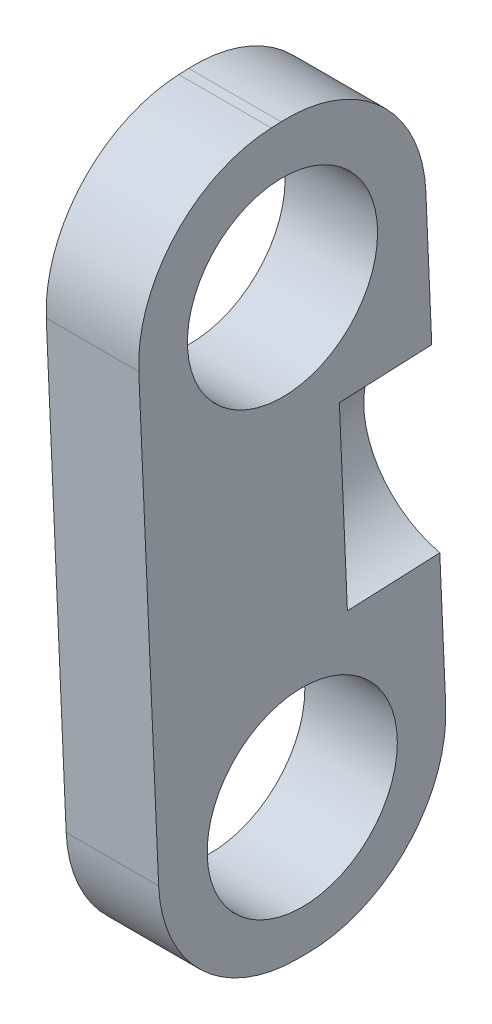
ISO-10303-21;
HEADER;
FILE_DESCRIPTION(('STEP AP214'),'2;1');
FILE_NAME('part.step','',(''),(''),'','','');
FILE_SCHEMA(('AUTOMOTIVE_DESIGN { 1 0 10303 214 1 1 1 1 }'));
ENDSEC;
DATA;
#1=APPLICATION_CONTEXT('core data for automotive mechanical design processes');
#2=APPLICATION_PROTOCOL_DEFINITION('international standard','automotive_design',2000,#1);
#3=PRODUCT_CONTEXT('',#1,'mechanical');
#4=PRODUCT('Part','Part','',(#3));
#5=PRODUCT_RELATED_PRODUCT_CATEGORY('part','',(#4));
#6=PRODUCT_DEFINITION_FORMATION('','',#4);
#7=PRODUCT_DEFINITION_CONTEXT('part definition',#1,'design');
#8=PRODUCT_DEFINITION('design','',#6,#7);
#9=PRODUCT_DEFINITION_SHAPE('','',#8);
#10=(LENGTH_UNIT() NAMED_UNIT(*) SI_UNIT(.MILLI.,.METRE.));
#11=(NAMED_UNIT(*) PLANE_ANGLE_UNIT() SI_UNIT($,.RADIAN.));
#12=(NAMED_UNIT(*) SI_UNIT($,.STERADIAN.) SOLID_ANGLE_UNIT());
#13=UNCERTAINTY_MEASURE_WITH_UNIT(LENGTH_MEASURE(1.E-05),#10,'distance_accuracy_value','');
#14=(GEOMETRIC_REPRESENTATION_CONTEXT(3) GLOBAL_UNCERTAINTY_ASSIGNED_CONTEXT((#13)) GLOBAL_UNIT_ASSIGNED_CONTEXT((#10,
#11,#12)) REPRESENTATION_CONTEXT('',''));
#15=CARTESIAN_POINT('',(0.,0.,0.));
#16=DIRECTION('',(0.,0.,1.));
#17=DIRECTION('',(1.,0.,0.));
#18=AXIS2_PLACEMENT_3D('',#15,#16,#17);
#19=CARTESIAN_POINT('',(3.175,0.,0.));
#20=DIRECTION('',(-1.,0.,0.));
#21=DIRECTION('',(0.,0.,1.));
#22=AXIS2_PLACEMENT_3D('',#19,#20,#21);
#23=PLANE('',#22);
#24=DIRECTION('',(0.,-0.999048221581858,-0.0436193873653358));
#25=VECTOR('',#24,1.);
#26=CARTESIAN_POINT('',(3.175,7.82477285099917,-179.216762849016));
#27=LINE('',#26,#25);
#28=CARTESIAN_POINT('',(3.175,11.0938075378479,-179.074033712187));
#29=VERTEX_POINT('',#28);
#30=CARTESIAN_POINT('',(3.175,4.7680083411944,-179.350224069763));
#31=VERTEX_POINT('',#30);
#32=EDGE_CURVE('E11',#29,#31,#27,.T.);
#33=ORIENTED_EDGE('',*,*,#32,.F.);
#34=DIRECTION('',(0.,0.0436193873653358,-0.999048221581858));
#35=VECTOR('',#34,1.);
#36=CARTESIAN_POINT('',(3.175,11.0938075378479,-179.074033712187));
#37=LINE('',#36,#35);
#38=CARTESIAN_POINT('',(3.175,11.2322990927329,-182.24601181571));
#39=VERTEX_POINT('',#38);
#40=EDGE_CURVE('E124',#29,#39,#37,.T.);
#41=ORIENTED_EDGE('',*,*,#40,.T.);
#42=DIRECTION('',(0.,0.999048221581858,0.0436193873653358));
#43=VECTOR('',#42,1.);
#44=CARTESIAN_POINT('',(3.175,7.96326440588419,-182.388740952538));
#45=LINE('',#44,#43);
#46=CARTESIAN_POINT('',(3.175,15.8932096646902,-182.042512065326));
#47=VERTEX_POINT('',#46);
#48=EDGE_CURVE('E158',#39,#47,#45,.T.);
#49=ORIENTED_EDGE('',*,*,#48,.T.);
#50=CARTESIAN_POINT('',(3.175,15.6854723323628,-177.284544910042));
#51=DIRECTION('',(-1.,0.,0.));
#52=DIRECTION('',(0.,0.,1.));
#53=AXIS2_PLACEMENT_3D('',#50,#51,#52);
#54=CIRCLE('',#53,4.7625);
#55=CARTESIAN_POINT('',(3.175,20.4434394876464,-177.076807577715));
#56=VERTEX_POINT('',#55);
#57=EDGE_CURVE('E219',#47,#56,#54,.F.);
#58=ORIENTED_EDGE('',*,*,#57,.T.);
#59=DIRECTION('',(0.,-0.0436193873653367,0.999048221581858));
#60=VECTOR('',#59,1.);
#61=CARTESIAN_POINT('',(3.175,20.6511768199738,-181.834774732998));
#62=LINE('',#61,#60);
#63=CARTESIAN_POINT('',(3.175,20.4286764010665,-176.738677303918));
#64=VERTEX_POINT('',#63);
#65=EDGE_CURVE('E157',#56,#64,#62,.T.);
#66=ORIENTED_EDGE('',*,*,#65,.T.);
#67=CARTESIAN_POINT('',(3.175,15.6707092457829,-176.946414636246));
#68=DIRECTION('',(-1.,0.,0.));
#69=DIRECTION('',(0.,0.,1.));
#70=AXIS2_PLACEMENT_3D('',#67,#68,#69);
#71=CIRCLE('',#70,4.7625);
#72=CARTESIAN_POINT('',(3.175,15.4629719134555,-172.188447480962));
#73=VERTEX_POINT('',#72);
#74=EDGE_CURVE('E210',#64,#73,#71,.F.);
#75=ORIENTED_EDGE('',*,*,#74,.T.);
#76=DIRECTION('',(0.,-0.999048221581858,-0.0436193873653391));
#77=VECTOR('',#76,1.);
#78=CARTESIAN_POINT('',(3.175,-4.72464800820541,-173.06985800182));
#79=LINE('',#78,#77);
#80=CARTESIAN_POINT('',(3.175,-0.169885340532834,-172.870992769025));
#81=VERTEX_POINT('',#80);
#82=EDGE_CURVE('E162',#73,#81,#79,.T.);
#83=ORIENTED_EDGE('',*,*,#82,.T.);
#84=CARTESIAN_POINT('',(3.175,0.0378519917945936,-177.628959924309));
#85=DIRECTION('',(-1.,0.,0.));
#86=DIRECTION('',(0.,0.,1.));
#87=AXIS2_PLACEMENT_3D('',#84,#85,#86);
#88=CIRCLE('',#87,4.7625);
#89=CARTESIAN_POINT('',(3.175,-4.72464800820541,-177.628959924309));
#90=VERTEX_POINT('',#89);
#91=EDGE_CURVE('E213',#81,#90,#88,.F.);
#92=ORIENTED_EDGE('',*,*,#91,.T.);
#93=DIRECTION('',(0.,0.,-1.));
#94=VECTOR('',#93,1.);
#95=CARTESIAN_POINT('',(3.175,-4.7246480082054,-182.942707172078));
#96=LINE('',#95,#94);
#97=CARTESIAN_POINT('',(3.175,-4.72464800820541,-177.967734768386));
#98=VERTEX_POINT('',#97);
#99=EDGE_CURVE('E166',#90,#98,#96,.T.);
#100=ORIENTED_EDGE('',*,*,#99,.T.);
#101=CARTESIAN_POINT('',(3.175,0.0378519917945937,-177.967734768386));
#102=DIRECTION('',(-1.,0.,0.));
#103=DIRECTION('',(0.,0.,1.));
#104=AXIS2_PLACEMENT_3D('',#101,#102,#103);
#105=CIRCLE('',#104,4.7625);
#106=CARTESIAN_POINT('',(3.175,0.245589324122006,-182.725701923669));
#107=VERTEX_POINT('',#106);
#108=EDGE_CURVE('E216',#98,#107,#105,.F.);
#109=ORIENTED_EDGE('',*,*,#108,.T.);
#110=CARTESIAN_POINT('',(3.175,4.90649989607934,-182.522202173285));
#111=VERTEX_POINT('',#110);
#112=EDGE_CURVE('E131',#107,#111,#45,.T.);
#113=ORIENTED_EDGE('',*,*,#112,.T.);
#114=DIRECTION('',(0.,0.0436193873653358,-0.999048221581858));
#115=VECTOR('',#114,1.);
#116=CARTESIAN_POINT('',(3.175,4.7680083411944,-179.350224069763));
#117=LINE('',#116,#115);
#118=EDGE_CURVE('E55',#111,#31,#117,.F.);
#119=ORIENTED_EDGE('',*,*,#118,.T.);
#120=EDGE_LOOP('',(#33,#41,#49,#58,#66,#75,#83,#92,#100,#109,#113,#119));
#121=FACE_BOUND('',#120,.T.);
#122=CARTESIAN_POINT('',(3.175,15.4962910605337,-177.123417320712));
#123=DIRECTION('',(1.,0.,0.));
#124=DIRECTION('',(0.,0.,-1.));
#125=AXIS2_PLACEMENT_3D('',#122,#123,#124);
#126=CIRCLE('',#125,3.26389999999998);
#127=CARTESIAN_POINT('',(3.175,15.4962910605337,-180.387317320712));
#128=VERTEX_POINT('',#127);
#129=EDGE_CURVE('E147',#128,#128,#126,.T.);
#130=ORIENTED_EDGE('',*,*,#129,.F.);
#131=EDGE_LOOP('',(#130));
#132=FACE_BOUND('',#131,.T.);
#133=CARTESIAN_POINT('',(3.175,0.,-177.8));
#134=DIRECTION('',(1.,0.,0.));
#135=DIRECTION('',(0.,0.,-1.));
#136=AXIS2_PLACEMENT_3D('',#133,#134,#135);
#137=CIRCLE('',#136,3.26390000000001);
#138=CARTESIAN_POINT('',(3.175,0.,-181.0639));
#139=VERTEX_POINT('',#138);
#140=EDGE_CURVE('E139',#139,#139,#137,.T.);
#141=ORIENTED_EDGE('',*,*,#140,.F.);
#142=EDGE_LOOP('',(#141));
#143=FACE_BOUND('',#142,.T.);
#144=ADVANCED_FACE('F39',(#121,#132,#143),#23,.F.);
#145=CARTESIAN_POINT('',(0.,0.,0.));
#146=DIRECTION('',(-1.,0.,0.));
#147=DIRECTION('',(0.,0.,1.));
#148=AXIS2_PLACEMENT_3D('',#145,#146,#147);
#149=PLANE('',#148);
#150=CARTESIAN_POINT('',(0.,15.4962910605337,-177.123417320712));
#151=DIRECTION('',(1.,0.,0.));
#152=DIRECTION('',(0.,0.,-1.));
#153=AXIS2_PLACEMENT_3D('',#150,#151,#152);
#154=CIRCLE('',#153,3.26389999999998);
#155=CARTESIAN_POINT('',(0.,15.4962910605337,-180.387317320712));
#156=VERTEX_POINT('',#155);
#157=EDGE_CURVE('E143',#156,#156,#154,.T.);
#158=ORIENTED_EDGE('',*,*,#157,.T.);
#159=EDGE_LOOP('',(#158));
#160=FACE_BOUND('',#159,.T.);
#161=DIRECTION('',(0.,-0.0436193873653367,0.999048221581858));
#162=VECTOR('',#161,1.);
#163=CARTESIAN_POINT('',(0.,20.6511768199738,-181.834774732998));
#164=LINE('',#163,#162);
#165=CARTESIAN_POINT('',(0.,20.4434394876464,-177.076807577715));
#166=VERTEX_POINT('',#165);
#167=CARTESIAN_POINT('',(0.,20.4286764010665,-176.738677303918));
#168=VERTEX_POINT('',#167);
#169=EDGE_CURVE('E173',#166,#168,#164,.T.);
#170=ORIENTED_EDGE('',*,*,#169,.F.);
#171=CARTESIAN_POINT('',(0.,15.6854723323628,-177.284544910042));
#172=DIRECTION('',(-1.,0.,0.));
#173=DIRECTION('',(0.,0.,1.));
#174=AXIS2_PLACEMENT_3D('',#171,#172,#173);
#175=CIRCLE('',#174,4.7625);
#176=CARTESIAN_POINT('',(0.,15.8932096646902,-182.042512065326));
#177=VERTEX_POINT('',#176);
#178=EDGE_CURVE('E199',#166,#177,#175,.T.);
#179=ORIENTED_EDGE('',*,*,#178,.T.);
#180=DIRECTION('',(0.,0.999048221581858,0.0436193873653358));
#181=VECTOR('',#180,1.);
#182=CARTESIAN_POINT('',(0.,7.96326440588419,-182.388740952538));
#183=LINE('',#182,#181);
#184=CARTESIAN_POINT('',(0.,0.245589324122008,-182.725701923669));
#185=VERTEX_POINT('',#184);
#186=EDGE_CURVE('E151',#185,#177,#183,.T.);
#187=ORIENTED_EDGE('',*,*,#186,.F.);
#188=CARTESIAN_POINT('',(0.,0.0378519917945937,-177.967734768386));
#189=DIRECTION('',(-1.,0.,0.));
#190=DIRECTION('',(0.,0.,1.));
#191=AXIS2_PLACEMENT_3D('',#188,#189,#190);
#192=CIRCLE('',#191,4.7625);
#193=CARTESIAN_POINT('',(0.,-4.72464800820541,-177.967734768386));
#194=VERTEX_POINT('',#193);
#195=EDGE_CURVE('E196',#185,#194,#192,.T.);
#196=ORIENTED_EDGE('',*,*,#195,.T.);
#197=DIRECTION('',(0.,0.,-1.));
#198=VECTOR('',#197,1.);
#199=CARTESIAN_POINT('',(0.,-4.7246480082054,-182.942707172078));
#200=LINE('',#199,#198);
#201=CARTESIAN_POINT('',(0.,-4.72464800820541,-177.628959924309));
#202=VERTEX_POINT('',#201);
#203=EDGE_CURVE('E181',#202,#194,#200,.T.);
#204=ORIENTED_EDGE('',*,*,#203,.F.);
#205=CARTESIAN_POINT('',(0.,0.0378519917945936,-177.628959924309));
#206=DIRECTION('',(-1.,0.,0.));
#207=DIRECTION('',(0.,0.,1.));
#208=AXIS2_PLACEMENT_3D('',#205,#206,#207);
#209=CIRCLE('',#208,4.7625);
#210=CARTESIAN_POINT('',(0.,-0.169885340532834,-172.870992769025));
#211=VERTEX_POINT('',#210);
#212=EDGE_CURVE('E193',#202,#211,#209,.T.);
#213=ORIENTED_EDGE('',*,*,#212,.T.);
#214=DIRECTION('',(0.,-0.999048221581858,-0.0436193873653391));
#215=VECTOR('',#214,1.);
#216=CARTESIAN_POINT('',(0.,-4.72464800820541,-173.06985800182));
#217=LINE('',#216,#215);
#218=CARTESIAN_POINT('',(0.,15.4629719134555,-172.188447480962));
#219=VERTEX_POINT('',#218);
#220=EDGE_CURVE('E177',#219,#211,#217,.T.);
#221=ORIENTED_EDGE('',*,*,#220,.F.);
#222=CARTESIAN_POINT('',(0.,15.6707092457829,-176.946414636246));
#223=DIRECTION('',(-1.,0.,0.));
#224=DIRECTION('',(0.,0.,1.));
#225=AXIS2_PLACEMENT_3D('',#222,#223,#224);
#226=CIRCLE('',#225,4.7625);
#227=EDGE_CURVE('E190',#219,#168,#226,.T.);
#228=ORIENTED_EDGE('',*,*,#227,.T.);
#229=EDGE_LOOP('',(#170,#179,#187,#196,#204,#213,#221,#228));
#230=FACE_BOUND('',#229,.T.);
#231=CARTESIAN_POINT('',(0.,0.,-177.8));
#232=DIRECTION('',(1.,0.,0.));
#233=DIRECTION('',(0.,0.,-1.));
#234=AXIS2_PLACEMENT_3D('',#231,#232,#233);
#235=CIRCLE('',#234,3.26390000000001);
#236=CARTESIAN_POINT('',(0.,0.,-181.0639));
#237=VERTEX_POINT('',#236);
#238=EDGE_CURVE('E135',#237,#237,#235,.T.);
#239=ORIENTED_EDGE('',*,*,#238,.T.);
#240=EDGE_LOOP('',(#239));
#241=FACE_BOUND('',#240,.T.);
#242=ADVANCED_FACE('F247',(#160,#230,#241),#149,.T.);
#243=CARTESIAN_POINT('',(3.175,7.96326440588419,-182.388740952538));
#244=DIRECTION('',(0.,-0.0436193873653358,0.999048221581858));
#245=DIRECTION('',(0.,-0.999048221581858,-0.0436193873653358));
#246=AXIS2_PLACEMENT_3D('',#243,#244,#245);
#247=PLANE('',#246);
#248=ORIENTED_EDGE('',*,*,#48,.F.);
#249=CARTESIAN_POINT('',(3.96875,8.0693994944061,-182.384106994497));
#250=DIRECTION('',(0.,0.0436193873653358,-0.999048221581858));
#251=DIRECTION('',(0.,0.999048221581858,0.0436193873653358));
#252=AXIS2_PLACEMENT_3D('',#249,#250,#251);
#253=CIRCLE('',#252,3.2639);
#254=EDGE_CURVE('E126',#111,#39,#253,.T.);
#255=ORIENTED_EDGE('',*,*,#254,.F.);
#256=ORIENTED_EDGE('',*,*,#112,.F.);
#257=DIRECTION('',(-1.,0.,0.));
#258=VECTOR('',#257,1.);
#259=CARTESIAN_POINT('',(3.175,0.245589324122005,-182.725701923669));
#260=LINE('',#259,#258);
#261=EDGE_CURVE('E202',#107,#185,#260,.T.);
#262=ORIENTED_EDGE('',*,*,#261,.T.);
#263=ORIENTED_EDGE('',*,*,#186,.T.);
#264=DIRECTION('',(-1.,0.,0.));
#265=VECTOR('',#264,1.);
#266=CARTESIAN_POINT('',(3.175,15.8932096646902,-182.042512065326));
#267=LINE('',#266,#265);
#268=EDGE_CURVE('E206',#177,#47,#267,.F.);
#269=ORIENTED_EDGE('',*,*,#268,.T.);
#270=EDGE_LOOP('',(#248,#255,#256,#262,#263,#269));
#271=FACE_BOUND('',#270,.T.);
#272=ADVANCED_FACE('F256',(#271),#247,.F.);
#273=CARTESIAN_POINT('',(3.175,20.6511768199738,-181.834774732998));
#274=DIRECTION('',(0.,-0.999048221581858,-0.0436193873653367));
#275=DIRECTION('',(0.,0.0436193873653367,-0.999048221581858));
#276=AXIS2_PLACEMENT_3D('',#273,#274,#275);
#277=PLANE('',#276);
#278=ORIENTED_EDGE('',*,*,#65,.F.);
#279=DIRECTION('',(-1.,0.,0.));
#280=VECTOR('',#279,1.);
#281=CARTESIAN_POINT('',(3.175,20.4434394876464,-177.076807577715));
#282=LINE('',#281,#280);
#283=EDGE_CURVE('E186',#56,#166,#282,.T.);
#284=ORIENTED_EDGE('',*,*,#283,.T.);
#285=ORIENTED_EDGE('',*,*,#169,.T.);
#286=DIRECTION('',(-1.,0.,0.));
#287=VECTOR('',#286,1.);
#288=CARTESIAN_POINT('',(3.175,20.4286764010665,-176.738677303918));
#289=LINE('',#288,#287);
#290=EDGE_CURVE('E169',#168,#64,#289,.F.);
#291=ORIENTED_EDGE('',*,*,#290,.T.);
#292=EDGE_LOOP('',(#278,#284,#285,#291));
#293=FACE_BOUND('',#292,.T.);
#294=ADVANCED_FACE('F266',(#293),#277,.F.);
#295=CARTESIAN_POINT('',(3.175,-4.72464800820541,-173.06985800182));
#296=DIRECTION('',(0.,0.0436193873653391,-0.999048221581858));
#297=DIRECTION('',(0.,0.999048221581858,0.0436193873653391));
#298=AXIS2_PLACEMENT_3D('',#295,#296,#297);
#299=PLANE('',#298);
#300=ORIENTED_EDGE('',*,*,#220,.T.);
#301=DIRECTION('',(-1.,0.,0.));
#302=VECTOR('',#301,1.);
#303=CARTESIAN_POINT('',(3.175,-0.169885340532834,-172.870992769025));
#304=LINE('',#303,#302);
#305=EDGE_CURVE('E48',#211,#81,#304,.F.);
#306=ORIENTED_EDGE('',*,*,#305,.T.);
#307=ORIENTED_EDGE('',*,*,#82,.F.);
#308=DIRECTION('',(-1.,0.,0.));
#309=VECTOR('',#308,1.);
#310=CARTESIAN_POINT('',(3.175,15.4629719134555,-172.188447480962));
#311=LINE('',#310,#309);
#312=EDGE_CURVE('E228',#73,#219,#311,.T.);
#313=ORIENTED_EDGE('',*,*,#312,.T.);
#314=EDGE_LOOP('',(#300,#306,#307,#313));
#315=FACE_BOUND('',#314,.T.);
#316=ADVANCED_FACE('F235',(#315),#299,.F.);
#317=CARTESIAN_POINT('',(3.175,-4.7246480082054,-182.942707172078));
#318=DIRECTION('',(0.,1.,0.));
#319=DIRECTION('',(0.,0.,1.));
#320=AXIS2_PLACEMENT_3D('',#317,#318,#319);
#321=PLANE('',#320);
#322=ORIENTED_EDGE('',*,*,#203,.T.);
#323=DIRECTION('',(-1.,0.,0.));
#324=VECTOR('',#323,1.);
#325=CARTESIAN_POINT('',(3.175,-4.72464800820541,-177.967734768386));
#326=LINE('',#325,#324);
#327=EDGE_CURVE('E63',#194,#98,#326,.F.);
#328=ORIENTED_EDGE('',*,*,#327,.T.);
#329=ORIENTED_EDGE('',*,*,#99,.F.);
#330=DIRECTION('',(-1.,0.,0.));
#331=VECTOR('',#330,1.);
#332=CARTESIAN_POINT('',(3.175,-4.72464800820541,-177.628959924309));
#333=LINE('',#332,#331);
#334=EDGE_CURVE('E222',#90,#202,#333,.T.);
#335=ORIENTED_EDGE('',*,*,#334,.T.);
#336=EDGE_LOOP('',(#322,#328,#329,#335));
#337=FACE_BOUND('',#336,.T.);
#338=ADVANCED_FACE('F244',(#337),#321,.F.);
#339=CARTESIAN_POINT('',(3.175,15.4962910605337,-177.123417320712));
#340=DIRECTION('',(-1.,0.,0.));
#341=DIRECTION('',(0.,0.,1.));
#342=AXIS2_PLACEMENT_3D('',#339,#340,#341);
#343=CYLINDRICAL_SURFACE('',#342,3.26389999999998);
#344=ORIENTED_EDGE('',*,*,#129,.T.);
#345=EDGE_LOOP('',(#344));
#346=FACE_BOUND('',#345,.T.);
#347=ORIENTED_EDGE('',*,*,#157,.F.);
#348=EDGE_LOOP('',(#347));
#349=FACE_BOUND('',#348,.T.);
#350=ADVANCED_FACE('F283',(#346,#349),#343,.F.);
#351=CARTESIAN_POINT('',(3.175,0.,-177.8));
#352=DIRECTION('',(-1.,0.,0.));
#353=DIRECTION('',(0.,0.,1.));
#354=AXIS2_PLACEMENT_3D('',#351,#352,#353);
#355=CYLINDRICAL_SURFACE('',#354,3.26390000000001);
#356=ORIENTED_EDGE('',*,*,#140,.T.);
#357=EDGE_LOOP('',(#356));
#358=FACE_BOUND('',#357,.T.);
#359=ORIENTED_EDGE('',*,*,#238,.F.);
#360=EDGE_LOOP('',(#359));
#361=FACE_BOUND('',#360,.T.);
#362=ADVANCED_FACE('F296',(#358,#361),#355,.F.);
#363=CARTESIAN_POINT('',(3.175,15.6854723323628,-177.284544910042));
#364=DIRECTION('',(-1.,0.,0.));
#365=DIRECTION('',(0.,0.,1.));
#366=AXIS2_PLACEMENT_3D('',#363,#364,#365);
#367=CYLINDRICAL_SURFACE('',#366,4.7625);
#368=ORIENTED_EDGE('',*,*,#57,.F.);
#369=ORIENTED_EDGE('',*,*,#268,.F.);
#370=ORIENTED_EDGE('',*,*,#178,.F.);
#371=ORIENTED_EDGE('',*,*,#283,.F.);
#372=EDGE_LOOP('',(#368,#369,#370,#371));
#373=FACE_BOUND('',#372,.T.);
#374=ADVANCED_FACE('F264',(#373),#367,.T.);
#375=CARTESIAN_POINT('',(3.175,0.0378519917945937,-177.967734768386));
#376=DIRECTION('',(-1.,0.,0.));
#377=DIRECTION('',(0.,0.,1.));
#378=AXIS2_PLACEMENT_3D('',#375,#376,#377);
#379=CYLINDRICAL_SURFACE('',#378,4.7625);
#380=ORIENTED_EDGE('',*,*,#108,.F.);
#381=ORIENTED_EDGE('',*,*,#327,.F.);
#382=ORIENTED_EDGE('',*,*,#195,.F.);
#383=ORIENTED_EDGE('',*,*,#261,.F.);
#384=EDGE_LOOP('',(#380,#381,#382,#383));
#385=FACE_BOUND('',#384,.T.);
#386=ADVANCED_FACE('F253',(#385),#379,.T.);
#387=CARTESIAN_POINT('',(3.175,0.0378519917945936,-177.628959924309));
#388=DIRECTION('',(-1.,0.,0.));
#389=DIRECTION('',(0.,0.,1.));
#390=AXIS2_PLACEMENT_3D('',#387,#388,#389);
#391=CYLINDRICAL_SURFACE('',#390,4.7625);
#392=ORIENTED_EDGE('',*,*,#91,.F.);
#393=ORIENTED_EDGE('',*,*,#305,.F.);
#394=ORIENTED_EDGE('',*,*,#212,.F.);
#395=ORIENTED_EDGE('',*,*,#334,.F.);
#396=EDGE_LOOP('',(#392,#393,#394,#395));
#397=FACE_BOUND('',#396,.T.);
#398=ADVANCED_FACE('F242',(#397),#391,.T.);
#399=CARTESIAN_POINT('',(3.175,15.6707092457829,-176.946414636246));
#400=DIRECTION('',(-1.,0.,0.));
#401=DIRECTION('',(0.,0.,1.));
#402=AXIS2_PLACEMENT_3D('',#399,#400,#401);
#403=CYLINDRICAL_SURFACE('',#402,4.7625);
#404=ORIENTED_EDGE('',*,*,#74,.F.);
#405=ORIENTED_EDGE('',*,*,#290,.F.);
#406=ORIENTED_EDGE('',*,*,#227,.F.);
#407=ORIENTED_EDGE('',*,*,#312,.F.);
#408=EDGE_LOOP('',(#404,#405,#406,#407));
#409=FACE_BOUND('',#408,.T.);
#410=ADVANCED_FACE('F41',(#409),#403,.T.);
#411=CARTESIAN_POINT('',(3.96875,7.93090793952116,-179.212128890975));
#412=DIRECTION('',(0.,0.0436193873653358,-0.999048221581858));
#413=DIRECTION('',(0.,0.999048221581858,0.0436193873653358));
#414=AXIS2_PLACEMENT_3D('',#411,#412,#413);
#415=PLANE('',#414);
#416=ORIENTED_EDGE('',*,*,#32,.T.);
#417=CARTESIAN_POINT('',(3.96875,7.93090793952116,-179.212128890975));
#418=DIRECTION('',(0.,0.0436193873653358,-0.999048221581858));
#419=DIRECTION('',(0.,0.999048221581858,0.0436193873653358));
#420=AXIS2_PLACEMENT_3D('',#417,#418,#419);
#421=CIRCLE('',#420,3.2639);
#422=EDGE_CURVE('E120',#31,#29,#421,.T.);
#423=ORIENTED_EDGE('',*,*,#422,.T.);
#424=EDGE_LOOP('',(#416,#423));
#425=FACE_BOUND('',#424,.T.);
#426=ADVANCED_FACE('F119',(#425),#415,.T.);
#427=CARTESIAN_POINT('',(3.96875,7.93090793952116,-179.212128890975));
#428=DIRECTION('',(0.,0.0436193873653358,-0.999048221581858));
#429=DIRECTION('',(0.,0.999048221581858,0.0436193873653358));
#430=AXIS2_PLACEMENT_3D('',#427,#428,#429);
#431=CYLINDRICAL_SURFACE('',#430,3.2639);
#432=ORIENTED_EDGE('',*,*,#422,.F.);
#433=ORIENTED_EDGE('',*,*,#118,.F.);
#434=ORIENTED_EDGE('',*,*,#254,.T.);
#435=ORIENTED_EDGE('',*,*,#40,.F.);
#436=EDGE_LOOP('',(#432,#433,#434,#435));
#437=FACE_BOUND('',#436,.T.);
#438=ADVANCED_FACE('F123',(#437),#431,.F.);
#439=CLOSED_SHELL('',(#144,#242,#272,#294,#316,#338,#350,#362,#374,#386,#398,#410,#426,#438));
#440=MANIFOLD_SOLID_BREP('B2',#439);
#441=ADVANCED_BREP_SHAPE_REPRESENTATION('',(#18,#440),#14);
#442=SHAPE_DEFINITION_REPRESENTATION(#9,#441);
ENDSEC;
END-ISO-10303-21;
